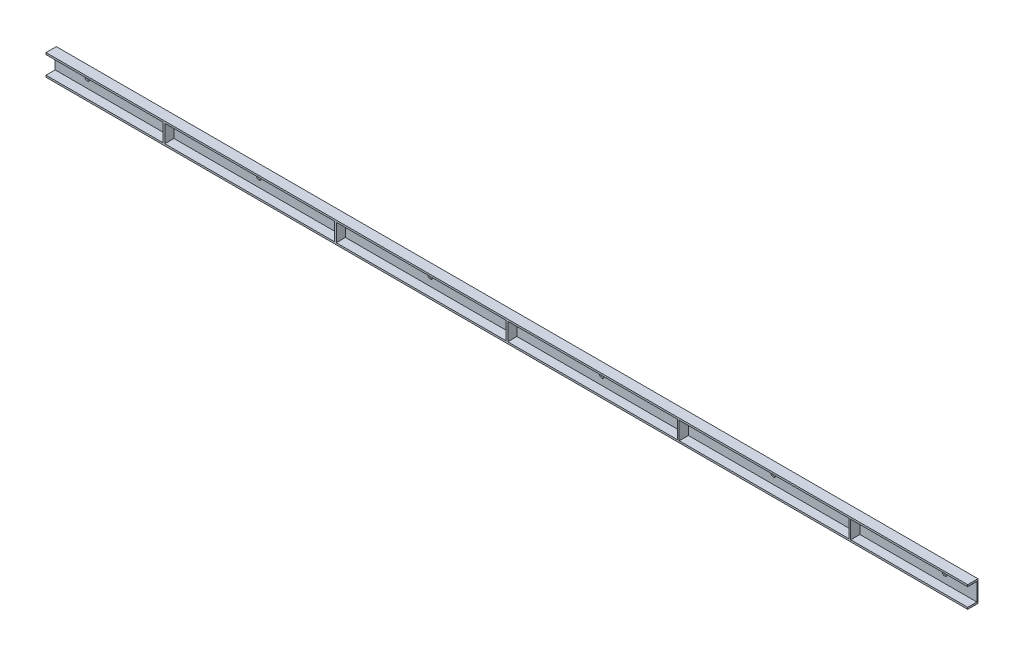
ISO-10303-21;
HEADER;
FILE_DESCRIPTION(('STEP AP214'),'2;1');
FILE_NAME('part.step','',(''),(''),'','','');
FILE_SCHEMA(('AUTOMOTIVE_DESIGN { 1 0 10303 214 1 1 1 1 }'));
ENDSEC;
DATA;
#1=APPLICATION_CONTEXT('core data for automotive mechanical design processes');
#2=APPLICATION_PROTOCOL_DEFINITION('international standard','automotive_design',2000,#1);
#3=PRODUCT_CONTEXT('',#1,'mechanical');
#4=PRODUCT('Part','Part','',(#3));
#5=PRODUCT_RELATED_PRODUCT_CATEGORY('part','',(#4));
#6=PRODUCT_DEFINITION_FORMATION('','',#4);
#7=PRODUCT_DEFINITION_CONTEXT('part definition',#1,'design');
#8=PRODUCT_DEFINITION('design','',#6,#7);
#9=PRODUCT_DEFINITION_SHAPE('','',#8);
#10=(LENGTH_UNIT() NAMED_UNIT(*) SI_UNIT(.MILLI.,.METRE.));
#11=(NAMED_UNIT(*) PLANE_ANGLE_UNIT() SI_UNIT($,.RADIAN.));
#12=(NAMED_UNIT(*) SI_UNIT($,.STERADIAN.) SOLID_ANGLE_UNIT());
#13=UNCERTAINTY_MEASURE_WITH_UNIT(LENGTH_MEASURE(1.E-05),#10,'distance_accuracy_value','');
#14=(GEOMETRIC_REPRESENTATION_CONTEXT(3) GLOBAL_UNCERTAINTY_ASSIGNED_CONTEXT((#13)) GLOBAL_UNIT_ASSIGNED_CONTEXT((#10,
#11,#12)) REPRESENTATION_CONTEXT('',''));
#15=CARTESIAN_POINT('',(0.,0.,0.));
#16=DIRECTION('',(0.,0.,1.));
#17=DIRECTION('',(1.,0.,0.));
#18=AXIS2_PLACEMENT_3D('',#15,#16,#17);
#19=CARTESIAN_POINT('',(0.,91.5,5.3));
#20=DIRECTION('',(0.,1.,0.));
#21=DIRECTION('',(0.,0.,1.));
#22=AXIS2_PLACEMENT_3D('',#19,#20,#21);
#23=PLANE('',#22);
#24=DIRECTION('',(0.,0.,-1.));
#25=VECTOR('',#24,1.);
#26=CARTESIAN_POINT('',(3745.75,91.5,48.));
#27=LINE('',#26,#25);
#28=CARTESIAN_POINT('',(3745.75,91.5,48.));
#29=VERTEX_POINT('',#28);
#30=CARTESIAN_POINT('',(3745.75,91.5,5.3));
#31=VERTEX_POINT('',#30);
#32=EDGE_CURVE('E238',#29,#31,#27,.T.);
#33=ORIENTED_EDGE('',*,*,#32,.F.);
#34=DIRECTION('',(-1.,0.,0.));
#35=VECTOR('',#34,1.);
#36=CARTESIAN_POINT('',(0.,91.5,48.));
#37=LINE('',#36,#35);
#38=CARTESIAN_POINT('',(2954.25,91.5,48.));
#39=VERTEX_POINT('',#38);
#40=EDGE_CURVE('E221',#29,#39,#37,.T.);
#41=ORIENTED_EDGE('',*,*,#40,.T.);
#42=DIRECTION('',(0.,0.,-1.));
#43=VECTOR('',#42,1.);
#44=CARTESIAN_POINT('',(2954.25,91.5,48.));
#45=LINE('',#44,#43);
#46=CARTESIAN_POINT('',(2954.25,91.5,5.3));
#47=VERTEX_POINT('',#46);
#48=EDGE_CURVE('E274',#39,#47,#45,.T.);
#49=ORIENTED_EDGE('',*,*,#48,.T.);
#50=DIRECTION('',(-1.,0.,0.));
#51=VECTOR('',#50,1.);
#52=CARTESIAN_POINT('',(0.,91.5,5.3));
#53=LINE('',#52,#51);
#54=EDGE_CURVE('E239',#31,#47,#53,.T.);
#55=ORIENTED_EDGE('',*,*,#54,.F.);
#56=EDGE_LOOP('',(#33,#41,#49,#55));
#57=FACE_BOUND('',#56,.T.);
#58=ADVANCED_FACE('F34',(#57),#23,.F.);
#59=DIRECTION('',(0.,0.,-1.));
#60=VECTOR('',#59,1.);
#61=CARTESIAN_POINT('',(3754.25,91.5,48.));
#62=LINE('',#61,#60);
#63=CARTESIAN_POINT('',(3754.25,91.5,48.));
#64=VERTEX_POINT('',#63);
#65=CARTESIAN_POINT('',(3754.25,91.5,5.3));
#66=VERTEX_POINT('',#65);
#67=EDGE_CURVE('E242',#64,#66,#62,.T.);
#68=ORIENTED_EDGE('',*,*,#67,.T.);
#69=CARTESIAN_POINT('',(4300.,91.5,5.3));
#70=VERTEX_POINT('',#69);
#71=EDGE_CURVE('E359',#70,#66,#53,.T.);
#72=ORIENTED_EDGE('',*,*,#71,.F.);
#73=DIRECTION('',(0.,0.,1.));
#74=VECTOR('',#73,1.);
#75=CARTESIAN_POINT('',(4300.,91.5,5.3));
#76=LINE('',#75,#74);
#77=CARTESIAN_POINT('',(4300.,91.5,48.));
#78=VERTEX_POINT('',#77);
#79=EDGE_CURVE('E371',#70,#78,#76,.T.);
#80=ORIENTED_EDGE('',*,*,#79,.T.);
#81=EDGE_CURVE('E233',#78,#64,#37,.T.);
#82=ORIENTED_EDGE('',*,*,#81,.T.);
#83=EDGE_LOOP('',(#68,#72,#80,#82));
#84=FACE_BOUND('',#83,.T.);
#85=ADVANCED_FACE('F433',(#84),#23,.F.);
#86=CARTESIAN_POINT('',(0.,8.50000000000001,5.3));
#87=DIRECTION('',(0.,-1.,0.));
#88=DIRECTION('',(1.,0.,0.));
#89=AXIS2_PLACEMENT_3D('',#86,#87,#88);
#90=PLANE('',#89);
#91=DIRECTION('',(0.,0.,-1.));
#92=VECTOR('',#91,1.);
#93=CARTESIAN_POINT('',(3745.75,8.50000000000001,48.));
#94=LINE('',#93,#92);
#95=CARTESIAN_POINT('',(3745.75,8.5,48.));
#96=VERTEX_POINT('',#95);
#97=CARTESIAN_POINT('',(3745.75,8.5,5.3));
#98=VERTEX_POINT('',#97);
#99=EDGE_CURVE('E57',#96,#98,#94,.T.);
#100=ORIENTED_EDGE('',*,*,#99,.T.);
#101=DIRECTION('',(1.,0.,0.));
#102=VECTOR('',#101,1.);
#103=CARTESIAN_POINT('',(0.,8.50000000000001,5.3));
#104=LINE('',#103,#102);
#105=CARTESIAN_POINT('',(2954.25,8.5,5.3));
#106=VERTEX_POINT('',#105);
#107=EDGE_CURVE('E556',#106,#98,#104,.T.);
#108=ORIENTED_EDGE('',*,*,#107,.F.);
#109=DIRECTION('',(0.,0.,-1.));
#110=VECTOR('',#109,1.);
#111=CARTESIAN_POINT('',(2954.25,8.50000000000001,48.));
#112=LINE('',#111,#110);
#113=CARTESIAN_POINT('',(2954.25,8.5,48.));
#114=VERTEX_POINT('',#113);
#115=EDGE_CURVE('E276',#114,#106,#112,.T.);
#116=ORIENTED_EDGE('',*,*,#115,.F.);
#117=DIRECTION('',(1.,0.,0.));
#118=VECTOR('',#117,1.);
#119=CARTESIAN_POINT('',(0.,8.50000000000001,48.));
#120=LINE('',#119,#118);
#121=EDGE_CURVE('E442',#114,#96,#120,.T.);
#122=ORIENTED_EDGE('',*,*,#121,.T.);
#123=EDGE_LOOP('',(#100,#108,#116,#122));
#124=FACE_BOUND('',#123,.T.);
#125=ADVANCED_FACE('F504',(#124),#90,.F.);
#126=DIRECTION('',(0.,0.,-1.));
#127=VECTOR('',#126,1.);
#128=CARTESIAN_POINT('',(3754.25,8.50000000000001,48.));
#129=LINE('',#128,#127);
#130=CARTESIAN_POINT('',(3754.25,8.5,48.));
#131=VERTEX_POINT('',#130);
#132=CARTESIAN_POINT('',(3754.25,8.5,5.3));
#133=VERTEX_POINT('',#132);
#134=EDGE_CURVE('E257',#131,#133,#129,.T.);
#135=ORIENTED_EDGE('',*,*,#134,.F.);
#136=CARTESIAN_POINT('',(4300.,8.5,48.));
#137=VERTEX_POINT('',#136);
#138=EDGE_CURVE('E347',#131,#137,#120,.T.);
#139=ORIENTED_EDGE('',*,*,#138,.T.);
#140=DIRECTION('',(0.,0.,1.));
#141=VECTOR('',#140,1.);
#142=CARTESIAN_POINT('',(4300.,8.5,5.3));
#143=LINE('',#142,#141);
#144=CARTESIAN_POINT('',(4300.,8.5,5.3));
#145=VERTEX_POINT('',#144);
#146=EDGE_CURVE('E373',#145,#137,#143,.T.);
#147=ORIENTED_EDGE('',*,*,#146,.F.);
#148=EDGE_CURVE('E351',#133,#145,#104,.T.);
#149=ORIENTED_EDGE('',*,*,#148,.F.);
#150=EDGE_LOOP('',(#135,#139,#147,#149));
#151=FACE_BOUND('',#150,.T.);
#152=ADVANCED_FACE('F440',(#151),#90,.F.);
#153=CARTESIAN_POINT('',(0.,8.50000000000001,5.3));
#154=DIRECTION('',(0.,0.,1.));
#155=DIRECTION('',(1.,0.,0.));
#156=AXIS2_PLACEMENT_3D('',#153,#154,#155);
#157=PLANE('',#156);
#158=CARTESIAN_POINT('',(3350.,50.,5.3));
#159=DIRECTION('',(0.,0.,1.));
#160=DIRECTION('',(1.,0.,0.));
#161=AXIS2_PLACEMENT_3D('',#158,#159,#160);
#162=CIRCLE('',#161,11.4999999999997);
#163=CARTESIAN_POINT('',(3361.5,50.,5.3));
#164=VERTEX_POINT('',#163);
#165=EDGE_CURVE('E777',#164,#164,#162,.T.);
#166=ORIENTED_EDGE('',*,*,#165,.F.);
#167=EDGE_LOOP('',(#166));
#168=FACE_BOUND('',#167,.T.);
#169=ORIENTED_EDGE('',*,*,#107,.T.);
#170=DIRECTION('',(0.,-1.,0.));
#171=VECTOR('',#170,1.);
#172=CARTESIAN_POINT('',(3745.75,91.5,5.3));
#173=LINE('',#172,#171);
#174=EDGE_CURVE('E249',#31,#98,#173,.T.);
#175=ORIENTED_EDGE('',*,*,#174,.F.);
#176=ORIENTED_EDGE('',*,*,#54,.T.);
#177=DIRECTION('',(0.,1.,0.));
#178=VECTOR('',#177,1.);
#179=CARTESIAN_POINT('',(2954.25,91.5,5.3));
#180=LINE('',#179,#178);
#181=EDGE_CURVE('E265',#106,#47,#180,.T.);
#182=ORIENTED_EDGE('',*,*,#181,.F.);
#183=EDGE_LOOP('',(#169,#175,#176,#182));
#184=FACE_BOUND('',#183,.T.);
#185=ADVANCED_FACE('F538',(#168,#184),#157,.T.);
#186=CARTESIAN_POINT('',(4150.,50.,5.3));
#187=DIRECTION('',(0.,0.,1.));
#188=DIRECTION('',(1.,0.,0.));
#189=AXIS2_PLACEMENT_3D('',#186,#187,#188);
#190=CIRCLE('',#189,11.4999999999997);
#191=CARTESIAN_POINT('',(4161.5,50.,5.3));
#192=VERTEX_POINT('',#191);
#193=EDGE_CURVE('E252',#192,#192,#190,.T.);
#194=ORIENTED_EDGE('',*,*,#193,.F.);
#195=EDGE_LOOP('',(#194));
#196=FACE_BOUND('',#195,.T.);
#197=ORIENTED_EDGE('',*,*,#71,.T.);
#198=DIRECTION('',(0.,1.,0.));
#199=VECTOR('',#198,1.);
#200=CARTESIAN_POINT('',(3754.25,91.5,5.3));
#201=LINE('',#200,#199);
#202=EDGE_CURVE('E49',#133,#66,#201,.T.);
#203=ORIENTED_EDGE('',*,*,#202,.F.);
#204=ORIENTED_EDGE('',*,*,#148,.T.);
#205=DIRECTION('',(0.,1.,0.));
#206=VECTOR('',#205,1.);
#207=CARTESIAN_POINT('',(4300.,91.5,5.3));
#208=LINE('',#207,#206);
#209=EDGE_CURVE('E355',#145,#70,#208,.T.);
#210=ORIENTED_EDGE('',*,*,#209,.T.);
#211=EDGE_LOOP('',(#197,#203,#204,#210));
#212=FACE_BOUND('',#211,.T.);
#213=ADVANCED_FACE('F435',(#196,#212),#157,.T.);
#214=DIRECTION('',(0.,0.,-1.));
#215=VECTOR('',#214,1.);
#216=CARTESIAN_POINT('',(2945.75,91.5,48.));
#217=LINE('',#216,#215);
#218=CARTESIAN_POINT('',(2945.75,91.5,48.));
#219=VERTEX_POINT('',#218);
#220=CARTESIAN_POINT('',(2945.75,91.5,5.3));
#221=VERTEX_POINT('',#220);
#222=EDGE_CURVE('E267',#219,#221,#217,.T.);
#223=ORIENTED_EDGE('',*,*,#222,.F.);
#224=CARTESIAN_POINT('',(2154.25,91.5,48.));
#225=VERTEX_POINT('',#224);
#226=EDGE_CURVE('E234',#219,#225,#37,.T.);
#227=ORIENTED_EDGE('',*,*,#226,.T.);
#228=DIRECTION('',(0.,0.,-1.));
#229=VECTOR('',#228,1.);
#230=CARTESIAN_POINT('',(2154.25,91.5,48.));
#231=LINE('',#230,#229);
#232=CARTESIAN_POINT('',(2154.25,91.5,5.3));
#233=VERTEX_POINT('',#232);
#234=EDGE_CURVE('E296',#225,#233,#231,.T.);
#235=ORIENTED_EDGE('',*,*,#234,.T.);
#236=EDGE_CURVE('E471',#221,#233,#53,.T.);
#237=ORIENTED_EDGE('',*,*,#236,.F.);
#238=EDGE_LOOP('',(#223,#227,#235,#237));
#239=FACE_BOUND('',#238,.T.);
#240=ADVANCED_FACE('F505',(#239),#23,.F.);
#241=DIRECTION('',(0.,0.,-1.));
#242=VECTOR('',#241,1.);
#243=CARTESIAN_POINT('',(2945.75,8.50000000000001,48.));
#244=LINE('',#243,#242);
#245=CARTESIAN_POINT('',(2945.75,8.5,48.));
#246=VERTEX_POINT('',#245);
#247=CARTESIAN_POINT('',(2945.75,8.5,5.3));
#248=VERTEX_POINT('',#247);
#249=EDGE_CURVE('E279',#246,#248,#244,.T.);
#250=ORIENTED_EDGE('',*,*,#249,.T.);
#251=CARTESIAN_POINT('',(2154.25,8.5,5.3));
#252=VERTEX_POINT('',#251);
#253=EDGE_CURVE('E552',#252,#248,#104,.T.);
#254=ORIENTED_EDGE('',*,*,#253,.F.);
#255=DIRECTION('',(0.,0.,-1.));
#256=VECTOR('',#255,1.);
#257=CARTESIAN_POINT('',(2154.25,8.50000000000001,48.));
#258=LINE('',#257,#256);
#259=CARTESIAN_POINT('',(2154.25,8.5,48.));
#260=VERTEX_POINT('',#259);
#261=EDGE_CURVE('E299',#260,#252,#258,.T.);
#262=ORIENTED_EDGE('',*,*,#261,.F.);
#263=EDGE_CURVE('E443',#260,#246,#120,.T.);
#264=ORIENTED_EDGE('',*,*,#263,.T.);
#265=EDGE_LOOP('',(#250,#254,#262,#264));
#266=FACE_BOUND('',#265,.T.);
#267=ADVANCED_FACE('F529',(#266),#90,.F.);
#268=CARTESIAN_POINT('',(2550.,50.,5.3));
#269=DIRECTION('',(0.,0.,1.));
#270=DIRECTION('',(1.,0.,0.));
#271=AXIS2_PLACEMENT_3D('',#268,#269,#270);
#272=CIRCLE('',#271,11.4999999999997);
#273=CARTESIAN_POINT('',(2561.5,50.,5.3));
#274=VERTEX_POINT('',#273);
#275=EDGE_CURVE('E771',#274,#274,#272,.T.);
#276=ORIENTED_EDGE('',*,*,#275,.F.);
#277=EDGE_LOOP('',(#276));
#278=FACE_BOUND('',#277,.T.);
#279=ORIENTED_EDGE('',*,*,#253,.T.);
#280=DIRECTION('',(0.,-1.,0.));
#281=VECTOR('',#280,1.);
#282=CARTESIAN_POINT('',(2945.75,91.5,5.3));
#283=LINE('',#282,#281);
#284=EDGE_CURVE('E261',#221,#248,#283,.T.);
#285=ORIENTED_EDGE('',*,*,#284,.F.);
#286=ORIENTED_EDGE('',*,*,#236,.T.);
#287=DIRECTION('',(0.,1.,0.));
#288=VECTOR('',#287,1.);
#289=CARTESIAN_POINT('',(2154.25,91.5,5.3));
#290=LINE('',#289,#288);
#291=EDGE_CURVE('E286',#252,#233,#290,.T.);
#292=ORIENTED_EDGE('',*,*,#291,.F.);
#293=EDGE_LOOP('',(#279,#285,#286,#292));
#294=FACE_BOUND('',#293,.T.);
#295=ADVANCED_FACE('F522',(#278,#294),#157,.T.);
#296=DIRECTION('',(0.,0.,-1.));
#297=VECTOR('',#296,1.);
#298=CARTESIAN_POINT('',(2145.75,91.5,48.));
#299=LINE('',#298,#297);
#300=CARTESIAN_POINT('',(2145.75,91.5,48.));
#301=VERTEX_POINT('',#300);
#302=CARTESIAN_POINT('',(2145.75,91.5,5.3));
#303=VERTEX_POINT('',#302);
#304=EDGE_CURVE('E289',#301,#303,#299,.T.);
#305=ORIENTED_EDGE('',*,*,#304,.F.);
#306=CARTESIAN_POINT('',(1354.25,91.5,48.));
#307=VERTEX_POINT('',#306);
#308=EDGE_CURVE('E549',#301,#307,#37,.T.);
#309=ORIENTED_EDGE('',*,*,#308,.T.);
#310=DIRECTION('',(0.,0.,-1.));
#311=VECTOR('',#310,1.);
#312=CARTESIAN_POINT('',(1354.25,91.5,48.));
#313=LINE('',#312,#311);
#314=CARTESIAN_POINT('',(1354.25,91.5,5.3));
#315=VERTEX_POINT('',#314);
#316=EDGE_CURVE('E319',#307,#315,#313,.T.);
#317=ORIENTED_EDGE('',*,*,#316,.T.);
#318=EDGE_CURVE('E470',#303,#315,#53,.T.);
#319=ORIENTED_EDGE('',*,*,#318,.F.);
#320=EDGE_LOOP('',(#305,#309,#317,#319));
#321=FACE_BOUND('',#320,.T.);
#322=ADVANCED_FACE('F515',(#321),#23,.F.);
#323=DIRECTION('',(0.,0.,-1.));
#324=VECTOR('',#323,1.);
#325=CARTESIAN_POINT('',(2145.75,8.50000000000001,48.));
#326=LINE('',#325,#324);
#327=CARTESIAN_POINT('',(2145.75,8.5,48.));
#328=VERTEX_POINT('',#327);
#329=CARTESIAN_POINT('',(2145.75,8.5,5.3));
#330=VERTEX_POINT('',#329);
#331=EDGE_CURVE('E302',#328,#330,#326,.T.);
#332=ORIENTED_EDGE('',*,*,#331,.T.);
#333=CARTESIAN_POINT('',(1354.25,8.50000000000001,5.3));
#334=VERTEX_POINT('',#333);
#335=EDGE_CURVE('E550',#334,#330,#104,.T.);
#336=ORIENTED_EDGE('',*,*,#335,.F.);
#337=DIRECTION('',(0.,0.,-1.));
#338=VECTOR('',#337,1.);
#339=CARTESIAN_POINT('',(1354.25,8.50000000000001,48.));
#340=LINE('',#339,#338);
#341=CARTESIAN_POINT('',(1354.25,8.50000000000001,48.));
#342=VERTEX_POINT('',#341);
#343=EDGE_CURVE('E322',#342,#334,#340,.T.);
#344=ORIENTED_EDGE('',*,*,#343,.F.);
#345=EDGE_CURVE('E444',#342,#328,#120,.T.);
#346=ORIENTED_EDGE('',*,*,#345,.T.);
#347=EDGE_LOOP('',(#332,#336,#344,#346));
#348=FACE_BOUND('',#347,.T.);
#349=ADVANCED_FACE('F520',(#348),#90,.F.);
#350=CARTESIAN_POINT('',(1750.,50.,5.3));
#351=DIRECTION('',(0.,0.,1.));
#352=DIRECTION('',(1.,0.,0.));
#353=AXIS2_PLACEMENT_3D('',#350,#351,#352);
#354=CIRCLE('',#353,11.4999999999997);
#355=CARTESIAN_POINT('',(1761.5,50.,5.3));
#356=VERTEX_POINT('',#355);
#357=EDGE_CURVE('E765',#356,#356,#354,.T.);
#358=ORIENTED_EDGE('',*,*,#357,.F.);
#359=EDGE_LOOP('',(#358));
#360=FACE_BOUND('',#359,.T.);
#361=ORIENTED_EDGE('',*,*,#335,.T.);
#362=DIRECTION('',(0.,-1.,0.));
#363=VECTOR('',#362,1.);
#364=CARTESIAN_POINT('',(2145.75,91.5,5.3));
#365=LINE('',#364,#363);
#366=EDGE_CURVE('E281',#303,#330,#365,.T.);
#367=ORIENTED_EDGE('',*,*,#366,.F.);
#368=ORIENTED_EDGE('',*,*,#318,.T.);
#369=DIRECTION('',(0.,1.,0.));
#370=VECTOR('',#369,1.);
#371=CARTESIAN_POINT('',(1354.25,91.5,5.3));
#372=LINE('',#371,#370);
#373=EDGE_CURVE('E309',#334,#315,#372,.T.);
#374=ORIENTED_EDGE('',*,*,#373,.F.);
#375=EDGE_LOOP('',(#361,#367,#368,#374));
#376=FACE_BOUND('',#375,.T.);
#377=ADVANCED_FACE('F513',(#360,#376),#157,.T.);
#378=DIRECTION('',(0.,0.,-1.));
#379=VECTOR('',#378,1.);
#380=CARTESIAN_POINT('',(1345.75,91.5,48.));
#381=LINE('',#380,#379);
#382=CARTESIAN_POINT('',(1345.75,91.5,48.));
#383=VERTEX_POINT('',#382);
#384=CARTESIAN_POINT('',(1345.75,91.5,5.3));
#385=VERTEX_POINT('',#384);
#386=EDGE_CURVE('E312',#383,#385,#381,.T.);
#387=ORIENTED_EDGE('',*,*,#386,.F.);
#388=CARTESIAN_POINT('',(554.25,91.5,48.));
#389=VERTEX_POINT('',#388);
#390=EDGE_CURVE('E458',#383,#389,#37,.T.);
#391=ORIENTED_EDGE('',*,*,#390,.T.);
#392=DIRECTION('',(0.,0.,-1.));
#393=VECTOR('',#392,1.);
#394=CARTESIAN_POINT('',(554.25,91.5,48.));
#395=LINE('',#394,#393);
#396=CARTESIAN_POINT('',(554.25,91.5,5.3));
#397=VERTEX_POINT('',#396);
#398=EDGE_CURVE('E339',#389,#397,#395,.T.);
#399=ORIENTED_EDGE('',*,*,#398,.T.);
#400=EDGE_CURVE('E466',#385,#397,#53,.T.);
#401=ORIENTED_EDGE('',*,*,#400,.F.);
#402=EDGE_LOOP('',(#387,#391,#399,#401));
#403=FACE_BOUND('',#402,.T.);
#404=ADVANCED_FACE('F468',(#403),#23,.F.);
#405=DIRECTION('',(0.,0.,-1.));
#406=VECTOR('',#405,1.);
#407=CARTESIAN_POINT('',(1345.75,8.50000000000001,48.));
#408=LINE('',#407,#406);
#409=CARTESIAN_POINT('',(1345.75,8.50000000000001,48.));
#410=VERTEX_POINT('',#409);
#411=CARTESIAN_POINT('',(1345.75,8.50000000000001,5.3));
#412=VERTEX_POINT('',#411);
#413=EDGE_CURVE('E325',#410,#412,#408,.T.);
#414=ORIENTED_EDGE('',*,*,#413,.T.);
#415=CARTESIAN_POINT('',(554.25,8.50000000000001,5.3));
#416=VERTEX_POINT('',#415);
#417=EDGE_CURVE('E356',#416,#412,#104,.T.);
#418=ORIENTED_EDGE('',*,*,#417,.F.);
#419=DIRECTION('',(0.,0.,-1.));
#420=VECTOR('',#419,1.);
#421=CARTESIAN_POINT('',(554.25,8.50000000000001,48.));
#422=LINE('',#421,#420);
#423=CARTESIAN_POINT('',(554.25,8.50000000000001,48.));
#424=VERTEX_POINT('',#423);
#425=EDGE_CURVE('E342',#424,#416,#422,.T.);
#426=ORIENTED_EDGE('',*,*,#425,.F.);
#427=EDGE_CURVE('E365',#424,#410,#120,.T.);
#428=ORIENTED_EDGE('',*,*,#427,.T.);
#429=EDGE_LOOP('',(#414,#418,#426,#428));
#430=FACE_BOUND('',#429,.T.);
#431=ADVANCED_FACE('F452',(#430),#90,.F.);
#432=CARTESIAN_POINT('',(949.999999999998,50.,5.3));
#433=DIRECTION('',(0.,0.,1.));
#434=DIRECTION('',(1.,0.,0.));
#435=AXIS2_PLACEMENT_3D('',#432,#433,#434);
#436=CIRCLE('',#435,11.4999999999997);
#437=CARTESIAN_POINT('',(961.499999999998,50.,5.3));
#438=VERTEX_POINT('',#437);
#439=EDGE_CURVE('E759',#438,#438,#436,.T.);
#440=ORIENTED_EDGE('',*,*,#439,.F.);
#441=EDGE_LOOP('',(#440));
#442=FACE_BOUND('',#441,.T.);
#443=ORIENTED_EDGE('',*,*,#417,.T.);
#444=DIRECTION('',(0.,-1.,0.));
#445=VECTOR('',#444,1.);
#446=CARTESIAN_POINT('',(1345.75,91.5,5.3));
#447=LINE('',#446,#445);
#448=EDGE_CURVE('E304',#385,#412,#447,.T.);
#449=ORIENTED_EDGE('',*,*,#448,.F.);
#450=ORIENTED_EDGE('',*,*,#400,.T.);
#451=DIRECTION('',(0.,1.,0.));
#452=VECTOR('',#451,1.);
#453=CARTESIAN_POINT('',(554.25,91.5,5.3));
#454=LINE('',#453,#452);
#455=EDGE_CURVE('E331',#416,#397,#454,.T.);
#456=ORIENTED_EDGE('',*,*,#455,.F.);
#457=EDGE_LOOP('',(#443,#449,#450,#456));
#458=FACE_BOUND('',#457,.T.);
#459=ADVANCED_FACE('F464',(#442,#458),#157,.T.);
#460=DIRECTION('',(0.,0.,-1.));
#461=VECTOR('',#460,1.);
#462=CARTESIAN_POINT('',(545.75,91.5,48.));
#463=LINE('',#462,#461);
#464=CARTESIAN_POINT('',(545.75,91.5,48.));
#465=VERTEX_POINT('',#464);
#466=CARTESIAN_POINT('',(545.75,91.5,5.3));
#467=VERTEX_POINT('',#466);
#468=EDGE_CURVE('E334',#465,#467,#463,.T.);
#469=ORIENTED_EDGE('',*,*,#468,.F.);
#470=CARTESIAN_POINT('',(0.,91.5,48.));
#471=VERTEX_POINT('',#470);
#472=EDGE_CURVE('E364',#465,#471,#37,.T.);
#473=ORIENTED_EDGE('',*,*,#472,.T.);
#474=DIRECTION('',(0.,0.,1.));
#475=VECTOR('',#474,1.);
#476=CARTESIAN_POINT('',(0.,91.5,5.3));
#477=LINE('',#476,#475);
#478=CARTESIAN_POINT('',(0.,91.5,5.3));
#479=VERTEX_POINT('',#478);
#480=EDGE_CURVE('E367',#479,#471,#477,.T.);
#481=ORIENTED_EDGE('',*,*,#480,.F.);
#482=EDGE_CURVE('E358',#467,#479,#53,.T.);
#483=ORIENTED_EDGE('',*,*,#482,.F.);
#484=EDGE_LOOP('',(#469,#473,#481,#483));
#485=FACE_BOUND('',#484,.T.);
#486=ADVANCED_FACE('F479',(#485),#23,.F.);
#487=DIRECTION('',(0.,0.,-1.));
#488=VECTOR('',#487,1.);
#489=CARTESIAN_POINT('',(545.75,8.50000000000001,48.));
#490=LINE('',#489,#488);
#491=CARTESIAN_POINT('',(545.75,8.50000000000001,48.));
#492=VERTEX_POINT('',#491);
#493=CARTESIAN_POINT('',(545.75,8.50000000000001,5.3));
#494=VERTEX_POINT('',#493);
#495=EDGE_CURVE('E344',#492,#494,#490,.T.);
#496=ORIENTED_EDGE('',*,*,#495,.T.);
#497=CARTESIAN_POINT('',(0.,8.50000000000001,5.3));
#498=VERTEX_POINT('',#497);
#499=EDGE_CURVE('E352',#498,#494,#104,.T.);
#500=ORIENTED_EDGE('',*,*,#499,.F.);
#501=DIRECTION('',(0.,0.,1.));
#502=VECTOR('',#501,1.);
#503=CARTESIAN_POINT('',(0.,8.50000000000001,5.3));
#504=LINE('',#503,#502);
#505=CARTESIAN_POINT('',(0.,8.5,48.));
#506=VERTEX_POINT('',#505);
#507=EDGE_CURVE('E361',#498,#506,#504,.T.);
#508=ORIENTED_EDGE('',*,*,#507,.T.);
#509=EDGE_CURVE('E362',#506,#492,#120,.T.);
#510=ORIENTED_EDGE('',*,*,#509,.T.);
#511=EDGE_LOOP('',(#496,#500,#508,#510));
#512=FACE_BOUND('',#511,.T.);
#513=ADVANCED_FACE('F483',(#512),#90,.F.);
#514=CARTESIAN_POINT('',(149.999999999999,50.,5.3));
#515=DIRECTION('',(0.,0.,1.));
#516=DIRECTION('',(1.,0.,0.));
#517=AXIS2_PLACEMENT_3D('',#514,#515,#516);
#518=CIRCLE('',#517,11.4999999999997);
#519=CARTESIAN_POINT('',(161.499999999998,50.,5.3));
#520=VERTEX_POINT('',#519);
#521=EDGE_CURVE('E749',#520,#520,#518,.T.);
#522=ORIENTED_EDGE('',*,*,#521,.F.);
#523=EDGE_LOOP('',(#522));
#524=FACE_BOUND('',#523,.T.);
#525=ORIENTED_EDGE('',*,*,#499,.T.);
#526=DIRECTION('',(0.,-1.,0.));
#527=VECTOR('',#526,1.);
#528=CARTESIAN_POINT('',(545.75,91.5,5.3));
#529=LINE('',#528,#527);
#530=EDGE_CURVE('E327',#467,#494,#529,.T.);
#531=ORIENTED_EDGE('',*,*,#530,.F.);
#532=ORIENTED_EDGE('',*,*,#482,.T.);
#533=DIRECTION('',(0.,-1.,0.));
#534=VECTOR('',#533,1.);
#535=CARTESIAN_POINT('',(0.,91.5,5.3));
#536=LINE('',#535,#534);
#537=EDGE_CURVE('E348',#479,#498,#536,.T.);
#538=ORIENTED_EDGE('',*,*,#537,.T.);
#539=EDGE_LOOP('',(#525,#531,#532,#538));
#540=FACE_BOUND('',#539,.T.);
#541=ADVANCED_FACE('F475',(#524,#540),#157,.T.);
#542=CARTESIAN_POINT('',(0.,0.,48.));
#543=DIRECTION('',(1.,0.,0.));
#544=DIRECTION('',(0.,0.,-1.));
#545=AXIS2_PLACEMENT_3D('',#542,#543,#544);
#546=PLANE('',#545);
#547=ORIENTED_EDGE('',*,*,#537,.F.);
#548=ORIENTED_EDGE('',*,*,#480,.T.);
#549=DIRECTION('',(0.,-1.,0.));
#550=VECTOR('',#549,1.);
#551=CARTESIAN_POINT('',(0.,0.,48.));
#552=LINE('',#551,#550);
#553=CARTESIAN_POINT('',(0.,100.,48.));
#554=VERTEX_POINT('',#553);
#555=EDGE_CURVE('E377',#554,#471,#552,.T.);
#556=ORIENTED_EDGE('',*,*,#555,.F.);
#557=DIRECTION('',(0.,0.,-1.));
#558=VECTOR('',#557,1.);
#559=CARTESIAN_POINT('',(0.,100.,48.));
#560=LINE('',#559,#558);
#561=CARTESIAN_POINT('',(0.,100.,0.));
#562=VERTEX_POINT('',#561);
#563=EDGE_CURVE('E389',#554,#562,#560,.T.);
#564=ORIENTED_EDGE('',*,*,#563,.T.);
#565=DIRECTION('',(0.,-1.,0.));
#566=VECTOR('',#565,1.);
#567=CARTESIAN_POINT('',(0.,0.,0.));
#568=LINE('',#567,#566);
#569=CARTESIAN_POINT('',(0.,0.,0.));
#570=VERTEX_POINT('',#569);
#571=EDGE_CURVE('E370',#562,#570,#568,.T.);
#572=ORIENTED_EDGE('',*,*,#571,.T.);
#573=DIRECTION('',(0.,0.,-1.));
#574=VECTOR('',#573,1.);
#575=CARTESIAN_POINT('',(0.,0.,48.));
#576=LINE('',#575,#574);
#577=CARTESIAN_POINT('',(0.,0.,48.));
#578=VERTEX_POINT('',#577);
#579=EDGE_CURVE('E11',#578,#570,#576,.T.);
#580=ORIENTED_EDGE('',*,*,#579,.F.);
#581=EDGE_CURVE('E381',#506,#578,#552,.T.);
#582=ORIENTED_EDGE('',*,*,#581,.F.);
#583=ORIENTED_EDGE('',*,*,#507,.F.);
#584=EDGE_LOOP('',(#547,#548,#556,#564,#572,#580,#582,#583));
#585=FACE_BOUND('',#584,.T.);
#586=ADVANCED_FACE('F36',(#585),#546,.F.);
#587=CARTESIAN_POINT('',(0.,0.,48.));
#588=DIRECTION('',(0.,1.,0.));
#589=DIRECTION('',(0.,0.,1.));
#590=AXIS2_PLACEMENT_3D('',#587,#588,#589);
#591=PLANE('',#590);
#592=DIRECTION('',(1.,0.,0.));
#593=VECTOR('',#592,1.);
#594=CARTESIAN_POINT('',(0.,0.,0.));
#595=LINE('',#594,#593);
#596=CARTESIAN_POINT('',(4300.,0.,0.));
#597=VERTEX_POINT('',#596);
#598=EDGE_CURVE('E392',#570,#597,#595,.T.);
#599=ORIENTED_EDGE('',*,*,#598,.T.);
#600=DIRECTION('',(0.,0.,-1.));
#601=VECTOR('',#600,1.);
#602=CARTESIAN_POINT('',(4300.,0.,48.));
#603=LINE('',#602,#601);
#604=CARTESIAN_POINT('',(4300.,0.,48.));
#605=VERTEX_POINT('',#604);
#606=EDGE_CURVE('E42',#605,#597,#603,.T.);
#607=ORIENTED_EDGE('',*,*,#606,.F.);
#608=DIRECTION('',(1.,0.,0.));
#609=VECTOR('',#608,1.);
#610=CARTESIAN_POINT('',(0.,0.,48.));
#611=LINE('',#610,#609);
#612=EDGE_CURVE('E380',#578,#605,#611,.T.);
#613=ORIENTED_EDGE('',*,*,#612,.F.);
#614=ORIENTED_EDGE('',*,*,#579,.T.);
#615=EDGE_LOOP('',(#599,#607,#613,#614));
#616=FACE_BOUND('',#615,.T.);
#617=ADVANCED_FACE('F819',(#616),#591,.F.);
#618=CARTESIAN_POINT('',(4300.,0.,48.));
#619=DIRECTION('',(-1.,0.,0.));
#620=DIRECTION('',(0.,-1.,0.));
#621=AXIS2_PLACEMENT_3D('',#618,#619,#620);
#622=PLANE('',#621);
#623=DIRECTION('',(0.,1.,0.));
#624=VECTOR('',#623,1.);
#625=CARTESIAN_POINT('',(4300.,0.,48.));
#626=LINE('',#625,#624);
#627=CARTESIAN_POINT('',(4300.,100.,48.));
#628=VERTEX_POINT('',#627);
#629=EDGE_CURVE('E383',#78,#628,#626,.T.);
#630=ORIENTED_EDGE('',*,*,#629,.F.);
#631=ORIENTED_EDGE('',*,*,#79,.F.);
#632=ORIENTED_EDGE('',*,*,#209,.F.);
#633=ORIENTED_EDGE('',*,*,#146,.T.);
#634=EDGE_CURVE('E384',#605,#137,#626,.T.);
#635=ORIENTED_EDGE('',*,*,#634,.F.);
#636=ORIENTED_EDGE('',*,*,#606,.T.);
#637=DIRECTION('',(0.,1.,0.));
#638=VECTOR('',#637,1.);
#639=CARTESIAN_POINT('',(4300.,0.,0.));
#640=LINE('',#639,#638);
#641=CARTESIAN_POINT('',(4300.,100.,0.));
#642=VERTEX_POINT('',#641);
#643=EDGE_CURVE('E394',#597,#642,#640,.T.);
#644=ORIENTED_EDGE('',*,*,#643,.T.);
#645=DIRECTION('',(0.,0.,-1.));
#646=VECTOR('',#645,1.);
#647=CARTESIAN_POINT('',(4300.,100.,48.));
#648=LINE('',#647,#646);
#649=EDGE_CURVE('E400',#628,#642,#648,.T.);
#650=ORIENTED_EDGE('',*,*,#649,.F.);
#651=EDGE_LOOP('',(#630,#631,#632,#633,#635,#636,#644,#650));
#652=FACE_BOUND('',#651,.T.);
#653=ADVANCED_FACE('F408',(#652),#622,.F.);
#654=CARTESIAN_POINT('',(0.,100.,48.));
#655=DIRECTION('',(0.,-1.,0.));
#656=DIRECTION('',(0.,0.,-1.));
#657=AXIS2_PLACEMENT_3D('',#654,#655,#656);
#658=PLANE('',#657);
#659=DIRECTION('',(-1.,0.,0.));
#660=VECTOR('',#659,1.);
#661=CARTESIAN_POINT('',(0.,100.,0.));
#662=LINE('',#661,#660);
#663=EDGE_CURVE('E396',#642,#562,#662,.T.);
#664=ORIENTED_EDGE('',*,*,#663,.T.);
#665=ORIENTED_EDGE('',*,*,#563,.F.);
#666=DIRECTION('',(-1.,0.,0.));
#667=VECTOR('',#666,1.);
#668=CARTESIAN_POINT('',(0.,100.,48.));
#669=LINE('',#668,#667);
#670=EDGE_CURVE('E387',#628,#554,#669,.T.);
#671=ORIENTED_EDGE('',*,*,#670,.F.);
#672=ORIENTED_EDGE('',*,*,#649,.T.);
#673=EDGE_LOOP('',(#664,#665,#671,#672));
#674=FACE_BOUND('',#673,.T.);
#675=ADVANCED_FACE('F418',(#674),#658,.F.);
#676=CARTESIAN_POINT('',(0.,100.,48.));
#677=DIRECTION('',(0.,0.,-1.));
#678=DIRECTION('',(-1.,0.,0.));
#679=AXIS2_PLACEMENT_3D('',#676,#677,#678);
#680=PLANE('',#679);
#681=ORIENTED_EDGE('',*,*,#138,.F.);
#682=DIRECTION('',(0.,1.,0.));
#683=VECTOR('',#682,1.);
#684=CARTESIAN_POINT('',(3754.25,91.5,48.));
#685=LINE('',#684,#683);
#686=EDGE_CURVE('E243',#131,#64,#685,.T.);
#687=ORIENTED_EDGE('',*,*,#686,.T.);
#688=ORIENTED_EDGE('',*,*,#81,.F.);
#689=ORIENTED_EDGE('',*,*,#629,.T.);
#690=ORIENTED_EDGE('',*,*,#670,.T.);
#691=ORIENTED_EDGE('',*,*,#555,.T.);
#692=ORIENTED_EDGE('',*,*,#472,.F.);
#693=DIRECTION('',(0.,-1.,0.));
#694=VECTOR('',#693,1.);
#695=CARTESIAN_POINT('',(545.75,91.5,48.));
#696=LINE('',#695,#694);
#697=EDGE_CURVE('E328',#465,#492,#696,.T.);
#698=ORIENTED_EDGE('',*,*,#697,.T.);
#699=ORIENTED_EDGE('',*,*,#509,.F.);
#700=ORIENTED_EDGE('',*,*,#581,.T.);
#701=ORIENTED_EDGE('',*,*,#612,.T.);
#702=ORIENTED_EDGE('',*,*,#634,.T.);
#703=EDGE_LOOP('',(#681,#687,#688,#689,#690,#691,#692,#698,#699,#700,#701,#702));
#704=FACE_BOUND('',#703,.T.);
#705=ORIENTED_EDGE('',*,*,#121,.F.);
#706=DIRECTION('',(0.,1.,0.));
#707=VECTOR('',#706,1.);
#708=CARTESIAN_POINT('',(2954.25,91.5,48.));
#709=LINE('',#708,#707);
#710=EDGE_CURVE('E229',#114,#39,#709,.T.);
#711=ORIENTED_EDGE('',*,*,#710,.T.);
#712=ORIENTED_EDGE('',*,*,#40,.F.);
#713=DIRECTION('',(0.,-1.,0.));
#714=VECTOR('',#713,1.);
#715=CARTESIAN_POINT('',(3745.75,91.5,48.));
#716=LINE('',#715,#714);
#717=EDGE_CURVE('E227',#29,#96,#716,.T.);
#718=ORIENTED_EDGE('',*,*,#717,.T.);
#719=EDGE_LOOP('',(#705,#711,#712,#718));
#720=FACE_BOUND('',#719,.T.);
#721=ORIENTED_EDGE('',*,*,#263,.F.);
#722=DIRECTION('',(0.,1.,0.));
#723=VECTOR('',#722,1.);
#724=CARTESIAN_POINT('',(2154.25,91.5,48.));
#725=LINE('',#724,#723);
#726=EDGE_CURVE('E285',#260,#225,#725,.T.);
#727=ORIENTED_EDGE('',*,*,#726,.T.);
#728=ORIENTED_EDGE('',*,*,#226,.F.);
#729=DIRECTION('',(0.,-1.,0.));
#730=VECTOR('',#729,1.);
#731=CARTESIAN_POINT('',(2945.75,91.5,48.));
#732=LINE('',#731,#730);
#733=EDGE_CURVE('E262',#219,#246,#732,.T.);
#734=ORIENTED_EDGE('',*,*,#733,.T.);
#735=EDGE_LOOP('',(#721,#727,#728,#734));
#736=FACE_BOUND('',#735,.T.);
#737=ORIENTED_EDGE('',*,*,#345,.F.);
#738=DIRECTION('',(0.,1.,0.));
#739=VECTOR('',#738,1.);
#740=CARTESIAN_POINT('',(1354.25,91.5,48.));
#741=LINE('',#740,#739);
#742=EDGE_CURVE('E308',#342,#307,#741,.T.);
#743=ORIENTED_EDGE('',*,*,#742,.T.);
#744=ORIENTED_EDGE('',*,*,#308,.F.);
#745=DIRECTION('',(0.,-1.,0.));
#746=VECTOR('',#745,1.);
#747=CARTESIAN_POINT('',(2145.75,91.5,48.));
#748=LINE('',#747,#746);
#749=EDGE_CURVE('E282',#301,#328,#748,.T.);
#750=ORIENTED_EDGE('',*,*,#749,.T.);
#751=EDGE_LOOP('',(#737,#743,#744,#750));
#752=FACE_BOUND('',#751,.T.);
#753=DIRECTION('',(0.,-1.,0.));
#754=VECTOR('',#753,1.);
#755=CARTESIAN_POINT('',(1345.75,91.5,48.));
#756=LINE('',#755,#754);
#757=EDGE_CURVE('E305',#383,#410,#756,.T.);
#758=ORIENTED_EDGE('',*,*,#757,.T.);
#759=ORIENTED_EDGE('',*,*,#427,.F.);
#760=DIRECTION('',(0.,1.,0.));
#761=VECTOR('',#760,1.);
#762=CARTESIAN_POINT('',(554.25,91.5,48.));
#763=LINE('',#762,#761);
#764=EDGE_CURVE('E330',#424,#389,#763,.T.);
#765=ORIENTED_EDGE('',*,*,#764,.T.);
#766=ORIENTED_EDGE('',*,*,#390,.F.);
#767=EDGE_LOOP('',(#758,#759,#765,#766));
#768=FACE_BOUND('',#767,.T.);
#769=ADVANCED_FACE('F224',(#704,#720,#736,#752,#768),#680,.F.);
#770=CARTESIAN_POINT('',(0.,100.,0.));
#771=DIRECTION('',(0.,0.,-1.));
#772=DIRECTION('',(-1.,0.,0.));
#773=AXIS2_PLACEMENT_3D('',#770,#771,#772);
#774=PLANE('',#773);
#775=CARTESIAN_POINT('',(149.999999999999,50.,0.));
#776=DIRECTION('',(0.,0.,-1.));
#777=DIRECTION('',(-1.,0.,0.));
#778=AXIS2_PLACEMENT_3D('',#775,#776,#777);
#779=CIRCLE('',#778,11.4999999999997);
#780=CARTESIAN_POINT('',(138.499999999999,50.,0.));
#781=VERTEX_POINT('',#780);
#782=EDGE_CURVE('E752',#781,#781,#779,.T.);
#783=ORIENTED_EDGE('',*,*,#782,.F.);
#784=EDGE_LOOP('',(#783));
#785=FACE_BOUND('',#784,.T.);
#786=CARTESIAN_POINT('',(949.999999999998,50.,0.));
#787=DIRECTION('',(0.,0.,-1.));
#788=DIRECTION('',(-1.,0.,0.));
#789=AXIS2_PLACEMENT_3D('',#786,#787,#788);
#790=CIRCLE('',#789,11.4999999999997);
#791=CARTESIAN_POINT('',(938.499999999999,50.,0.));
#792=VERTEX_POINT('',#791);
#793=EDGE_CURVE('E754',#792,#792,#790,.T.);
#794=ORIENTED_EDGE('',*,*,#793,.F.);
#795=EDGE_LOOP('',(#794));
#796=FACE_BOUND('',#795,.T.);
#797=CARTESIAN_POINT('',(1750.,50.,0.));
#798=DIRECTION('',(0.,0.,-1.));
#799=DIRECTION('',(-1.,0.,0.));
#800=AXIS2_PLACEMENT_3D('',#797,#798,#799);
#801=CIRCLE('',#800,11.4999999999997);
#802=CARTESIAN_POINT('',(1738.5,50.,0.));
#803=VERTEX_POINT('',#802);
#804=EDGE_CURVE('E762',#803,#803,#801,.T.);
#805=ORIENTED_EDGE('',*,*,#804,.F.);
#806=EDGE_LOOP('',(#805));
#807=FACE_BOUND('',#806,.T.);
#808=CARTESIAN_POINT('',(2550.,50.,0.));
#809=DIRECTION('',(0.,0.,-1.));
#810=DIRECTION('',(-1.,0.,0.));
#811=AXIS2_PLACEMENT_3D('',#808,#809,#810);
#812=CIRCLE('',#811,11.4999999999997);
#813=CARTESIAN_POINT('',(2538.5,50.,0.));
#814=VERTEX_POINT('',#813);
#815=EDGE_CURVE('E768',#814,#814,#812,.T.);
#816=ORIENTED_EDGE('',*,*,#815,.F.);
#817=EDGE_LOOP('',(#816));
#818=FACE_BOUND('',#817,.T.);
#819=CARTESIAN_POINT('',(3350.,50.,0.));
#820=DIRECTION('',(0.,0.,-1.));
#821=DIRECTION('',(-1.,0.,0.));
#822=AXIS2_PLACEMENT_3D('',#819,#820,#821);
#823=CIRCLE('',#822,11.4999999999997);
#824=CARTESIAN_POINT('',(3338.5,50.,0.));
#825=VERTEX_POINT('',#824);
#826=EDGE_CURVE('E774',#825,#825,#823,.T.);
#827=ORIENTED_EDGE('',*,*,#826,.F.);
#828=EDGE_LOOP('',(#827));
#829=FACE_BOUND('',#828,.T.);
#830=CARTESIAN_POINT('',(4150.,50.,0.));
#831=DIRECTION('',(0.,0.,-1.));
#832=DIRECTION('',(-1.,0.,0.));
#833=AXIS2_PLACEMENT_3D('',#830,#831,#832);
#834=CIRCLE('',#833,11.4999999999997);
#835=CARTESIAN_POINT('',(4138.5,50.,0.));
#836=VERTEX_POINT('',#835);
#837=EDGE_CURVE('E779',#836,#836,#834,.T.);
#838=ORIENTED_EDGE('',*,*,#837,.F.);
#839=EDGE_LOOP('',(#838));
#840=FACE_BOUND('',#839,.T.);
#841=ORIENTED_EDGE('',*,*,#571,.F.);
#842=ORIENTED_EDGE('',*,*,#663,.F.);
#843=ORIENTED_EDGE('',*,*,#643,.F.);
#844=ORIENTED_EDGE('',*,*,#598,.F.);
#845=EDGE_LOOP('',(#841,#842,#843,#844));
#846=FACE_BOUND('',#845,.T.);
#847=ADVANCED_FACE('F415',(#785,#796,#807,#818,#829,#840,#846),#774,.T.);
#848=CARTESIAN_POINT('',(545.75,91.5,48.));
#849=DIRECTION('',(1.,0.,0.));
#850=DIRECTION('',(0.,0.,-1.));
#851=AXIS2_PLACEMENT_3D('',#848,#849,#850);
#852=PLANE('',#851);
#853=ORIENTED_EDGE('',*,*,#530,.T.);
#854=ORIENTED_EDGE('',*,*,#495,.F.);
#855=ORIENTED_EDGE('',*,*,#697,.F.);
#856=ORIENTED_EDGE('',*,*,#468,.T.);
#857=EDGE_LOOP('',(#853,#854,#855,#856));
#858=FACE_BOUND('',#857,.T.);
#859=ADVANCED_FACE('F486',(#858),#852,.F.);
#860=CARTESIAN_POINT('',(554.25,91.5,48.));
#861=DIRECTION('',(-1.,0.,0.));
#862=DIRECTION('',(0.,0.,1.));
#863=AXIS2_PLACEMENT_3D('',#860,#861,#862);
#864=PLANE('',#863);
#865=ORIENTED_EDGE('',*,*,#455,.T.);
#866=ORIENTED_EDGE('',*,*,#398,.F.);
#867=ORIENTED_EDGE('',*,*,#764,.F.);
#868=ORIENTED_EDGE('',*,*,#425,.T.);
#869=EDGE_LOOP('',(#865,#866,#867,#868));
#870=FACE_BOUND('',#869,.T.);
#871=ADVANCED_FACE('F488',(#870),#864,.F.);
#872=CARTESIAN_POINT('',(1345.75,91.5,48.));
#873=DIRECTION('',(1.,0.,0.));
#874=DIRECTION('',(0.,0.,-1.));
#875=AXIS2_PLACEMENT_3D('',#872,#873,#874);
#876=PLANE('',#875);
#877=ORIENTED_EDGE('',*,*,#448,.T.);
#878=ORIENTED_EDGE('',*,*,#413,.F.);
#879=ORIENTED_EDGE('',*,*,#757,.F.);
#880=ORIENTED_EDGE('',*,*,#386,.T.);
#881=EDGE_LOOP('',(#877,#878,#879,#880));
#882=FACE_BOUND('',#881,.T.);
#883=ADVANCED_FACE('F461',(#882),#876,.F.);
#884=CARTESIAN_POINT('',(1354.25,91.5,48.));
#885=DIRECTION('',(-1.,0.,0.));
#886=DIRECTION('',(0.,0.,1.));
#887=AXIS2_PLACEMENT_3D('',#884,#885,#886);
#888=PLANE('',#887);
#889=ORIENTED_EDGE('',*,*,#373,.T.);
#890=ORIENTED_EDGE('',*,*,#316,.F.);
#891=ORIENTED_EDGE('',*,*,#742,.F.);
#892=ORIENTED_EDGE('',*,*,#343,.T.);
#893=EDGE_LOOP('',(#889,#890,#891,#892));
#894=FACE_BOUND('',#893,.T.);
#895=ADVANCED_FACE('F579',(#894),#888,.F.);
#896=CARTESIAN_POINT('',(2145.75,91.5,48.));
#897=DIRECTION('',(1.,0.,0.));
#898=DIRECTION('',(0.,0.,-1.));
#899=AXIS2_PLACEMENT_3D('',#896,#897,#898);
#900=PLANE('',#899);
#901=ORIENTED_EDGE('',*,*,#366,.T.);
#902=ORIENTED_EDGE('',*,*,#331,.F.);
#903=ORIENTED_EDGE('',*,*,#749,.F.);
#904=ORIENTED_EDGE('',*,*,#304,.T.);
#905=EDGE_LOOP('',(#901,#902,#903,#904));
#906=FACE_BOUND('',#905,.T.);
#907=ADVANCED_FACE('F575',(#906),#900,.F.);
#908=CARTESIAN_POINT('',(2154.25,91.5,48.));
#909=DIRECTION('',(-1.,0.,0.));
#910=DIRECTION('',(0.,0.,1.));
#911=AXIS2_PLACEMENT_3D('',#908,#909,#910);
#912=PLANE('',#911);
#913=ORIENTED_EDGE('',*,*,#291,.T.);
#914=ORIENTED_EDGE('',*,*,#234,.F.);
#915=ORIENTED_EDGE('',*,*,#726,.F.);
#916=ORIENTED_EDGE('',*,*,#261,.T.);
#917=EDGE_LOOP('',(#913,#914,#915,#916));
#918=FACE_BOUND('',#917,.T.);
#919=ADVANCED_FACE('F569',(#918),#912,.F.);
#920=CARTESIAN_POINT('',(2945.75,91.5,48.));
#921=DIRECTION('',(1.,0.,0.));
#922=DIRECTION('',(0.,0.,-1.));
#923=AXIS2_PLACEMENT_3D('',#920,#921,#922);
#924=PLANE('',#923);
#925=ORIENTED_EDGE('',*,*,#284,.T.);
#926=ORIENTED_EDGE('',*,*,#249,.F.);
#927=ORIENTED_EDGE('',*,*,#733,.F.);
#928=ORIENTED_EDGE('',*,*,#222,.T.);
#929=EDGE_LOOP('',(#925,#926,#927,#928));
#930=FACE_BOUND('',#929,.T.);
#931=ADVANCED_FACE('F545',(#930),#924,.F.);
#932=CARTESIAN_POINT('',(2954.25,91.5,48.));
#933=DIRECTION('',(-1.,0.,0.));
#934=DIRECTION('',(0.,0.,1.));
#935=AXIS2_PLACEMENT_3D('',#932,#933,#934);
#936=PLANE('',#935);
#937=ORIENTED_EDGE('',*,*,#181,.T.);
#938=ORIENTED_EDGE('',*,*,#48,.F.);
#939=ORIENTED_EDGE('',*,*,#710,.F.);
#940=ORIENTED_EDGE('',*,*,#115,.T.);
#941=EDGE_LOOP('',(#937,#938,#939,#940));
#942=FACE_BOUND('',#941,.T.);
#943=ADVANCED_FACE('F561',(#942),#936,.F.);
#944=CARTESIAN_POINT('',(3745.75,91.5,48.));
#945=DIRECTION('',(1.,0.,0.));
#946=DIRECTION('',(0.,0.,-1.));
#947=AXIS2_PLACEMENT_3D('',#944,#945,#946);
#948=PLANE('',#947);
#949=ORIENTED_EDGE('',*,*,#174,.T.);
#950=ORIENTED_EDGE('',*,*,#99,.F.);
#951=ORIENTED_EDGE('',*,*,#717,.F.);
#952=ORIENTED_EDGE('',*,*,#32,.T.);
#953=EDGE_LOOP('',(#949,#950,#951,#952));
#954=FACE_BOUND('',#953,.T.);
#955=ADVANCED_FACE('F245',(#954),#948,.F.);
#956=CARTESIAN_POINT('',(3754.25,91.5,48.));
#957=DIRECTION('',(-1.,0.,0.));
#958=DIRECTION('',(0.,0.,1.));
#959=AXIS2_PLACEMENT_3D('',#956,#957,#958);
#960=PLANE('',#959);
#961=ORIENTED_EDGE('',*,*,#202,.T.);
#962=ORIENTED_EDGE('',*,*,#67,.F.);
#963=ORIENTED_EDGE('',*,*,#686,.F.);
#964=ORIENTED_EDGE('',*,*,#134,.T.);
#965=EDGE_LOOP('',(#961,#962,#963,#964));
#966=FACE_BOUND('',#965,.T.);
#967=ADVANCED_FACE('F437',(#966),#960,.F.);
#968=CARTESIAN_POINT('',(4150.,50.,48.));
#969=DIRECTION('',(0.,0.,-1.));
#970=DIRECTION('',(-1.,0.,0.));
#971=AXIS2_PLACEMENT_3D('',#968,#969,#970);
#972=CYLINDRICAL_SURFACE('',#971,11.4999999999997);
#973=ORIENTED_EDGE('',*,*,#193,.T.);
#974=EDGE_LOOP('',(#973));
#975=FACE_BOUND('',#974,.T.);
#976=ORIENTED_EDGE('',*,*,#837,.T.);
#977=EDGE_LOOP('',(#976));
#978=FACE_BOUND('',#977,.T.);
#979=ADVANCED_FACE('F625',(#975,#978),#972,.F.);
#980=CARTESIAN_POINT('',(3350.,50.,48.));
#981=DIRECTION('',(0.,0.,-1.));
#982=DIRECTION('',(-1.,0.,0.));
#983=AXIS2_PLACEMENT_3D('',#980,#981,#982);
#984=CYLINDRICAL_SURFACE('',#983,11.4999999999997);
#985=ORIENTED_EDGE('',*,*,#165,.T.);
#986=EDGE_LOOP('',(#985));
#987=FACE_BOUND('',#986,.T.);
#988=ORIENTED_EDGE('',*,*,#826,.T.);
#989=EDGE_LOOP('',(#988));
#990=FACE_BOUND('',#989,.T.);
#991=ADVANCED_FACE('F642',(#987,#990),#984,.F.);
#992=CARTESIAN_POINT('',(2550.,50.,48.));
#993=DIRECTION('',(0.,0.,-1.));
#994=DIRECTION('',(-1.,0.,0.));
#995=AXIS2_PLACEMENT_3D('',#992,#993,#994);
#996=CYLINDRICAL_SURFACE('',#995,11.4999999999997);
#997=ORIENTED_EDGE('',*,*,#275,.T.);
#998=EDGE_LOOP('',(#997));
#999=FACE_BOUND('',#998,.T.);
#1000=ORIENTED_EDGE('',*,*,#815,.T.);
#1001=EDGE_LOOP('',(#1000));
#1002=FACE_BOUND('',#1001,.T.);
#1003=ADVANCED_FACE('F702',(#999,#1002),#996,.F.);
#1004=CARTESIAN_POINT('',(1750.,50.,48.));
#1005=DIRECTION('',(0.,0.,-1.));
#1006=DIRECTION('',(-1.,0.,0.));
#1007=AXIS2_PLACEMENT_3D('',#1004,#1005,#1006);
#1008=CYLINDRICAL_SURFACE('',#1007,11.4999999999997);
#1009=ORIENTED_EDGE('',*,*,#357,.T.);
#1010=EDGE_LOOP('',(#1009));
#1011=FACE_BOUND('',#1010,.T.);
#1012=ORIENTED_EDGE('',*,*,#804,.T.);
#1013=EDGE_LOOP('',(#1012));
#1014=FACE_BOUND('',#1013,.T.);
#1015=ADVANCED_FACE('F712',(#1011,#1014),#1008,.F.);
#1016=CARTESIAN_POINT('',(949.999999999998,50.,48.));
#1017=DIRECTION('',(0.,0.,-1.));
#1018=DIRECTION('',(-1.,0.,0.));
#1019=AXIS2_PLACEMENT_3D('',#1016,#1017,#1018);
#1020=CYLINDRICAL_SURFACE('',#1019,11.4999999999997);
#1021=ORIENTED_EDGE('',*,*,#439,.T.);
#1022=EDGE_LOOP('',(#1021));
#1023=FACE_BOUND('',#1022,.T.);
#1024=ORIENTED_EDGE('',*,*,#793,.T.);
#1025=EDGE_LOOP('',(#1024));
#1026=FACE_BOUND('',#1025,.T.);
#1027=ADVANCED_FACE('F722',(#1023,#1026),#1020,.F.);
#1028=CARTESIAN_POINT('',(149.999999999999,50.,48.));
#1029=DIRECTION('',(0.,0.,-1.));
#1030=DIRECTION('',(-1.,0.,0.));
#1031=AXIS2_PLACEMENT_3D('',#1028,#1029,#1030);
#1032=CYLINDRICAL_SURFACE('',#1031,11.4999999999997);
#1033=ORIENTED_EDGE('',*,*,#521,.T.);
#1034=EDGE_LOOP('',(#1033));
#1035=FACE_BOUND('',#1034,.T.);
#1036=ORIENTED_EDGE('',*,*,#782,.T.);
#1037=EDGE_LOOP('',(#1036));
#1038=FACE_BOUND('',#1037,.T.);
#1039=ADVANCED_FACE('F732',(#1035,#1038),#1032,.F.);
#1040=CLOSED_SHELL('',(#58,#85,#125,#152,#185,#213,#240,#267,#295,#322,#349,#377,#404,#431,#459,
#486,#513,#541,#586,#617,#653,#675,#769,#847,#859,#871,#883,#895,#907,#919,#931,#943,#955,#967,
#979,#991,#1003,#1015,#1027,#1039));
#1041=MANIFOLD_SOLID_BREP('B2',#1040);
#1042=ADVANCED_BREP_SHAPE_REPRESENTATION('',(#18,#1041),#14);
#1043=SHAPE_DEFINITION_REPRESENTATION(#9,#1042);
ENDSEC;
END-ISO-10303-21;
